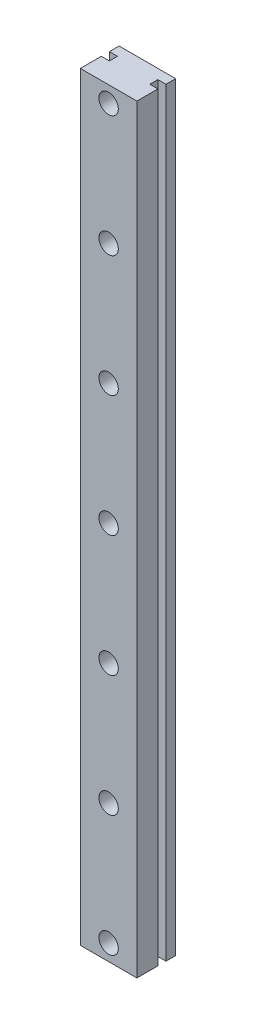
ISO-10303-21;
HEADER;
FILE_DESCRIPTION(('STEP AP214'),'2;1');
FILE_NAME('part.step','',(''),(''),'','','');
FILE_SCHEMA(('AUTOMOTIVE_DESIGN { 1 0 10303 214 1 1 1 1 }'));
ENDSEC;
DATA;
#1=APPLICATION_CONTEXT('core data for automotive mechanical design processes');
#2=APPLICATION_PROTOCOL_DEFINITION('international standard','automotive_design',2000,#1);
#3=PRODUCT_CONTEXT('',#1,'mechanical');
#4=PRODUCT('Part','Part','',(#3));
#5=PRODUCT_RELATED_PRODUCT_CATEGORY('part','',(#4));
#6=PRODUCT_DEFINITION_FORMATION('','',#4);
#7=PRODUCT_DEFINITION_CONTEXT('part definition',#1,'design');
#8=PRODUCT_DEFINITION('design','',#6,#7);
#9=PRODUCT_DEFINITION_SHAPE('','',#8);
#10=(LENGTH_UNIT() NAMED_UNIT(*) SI_UNIT(.MILLI.,.METRE.));
#11=(NAMED_UNIT(*) PLANE_ANGLE_UNIT() SI_UNIT($,.RADIAN.));
#12=(NAMED_UNIT(*) SI_UNIT($,.STERADIAN.) SOLID_ANGLE_UNIT());
#13=UNCERTAINTY_MEASURE_WITH_UNIT(LENGTH_MEASURE(1.E-05),#10,'distance_accuracy_value','');
#14=(GEOMETRIC_REPRESENTATION_CONTEXT(3) GLOBAL_UNCERTAINTY_ASSIGNED_CONTEXT((#13)) GLOBAL_UNIT_ASSIGNED_CONTEXT((#10,
#11,#12)) REPRESENTATION_CONTEXT('',''));
#15=CARTESIAN_POINT('',(0.,0.,0.));
#16=DIRECTION('',(0.,0.,1.));
#17=DIRECTION('',(1.,0.,0.));
#18=AXIS2_PLACEMENT_3D('',#15,#16,#17);
#19=CARTESIAN_POINT('',(0.,94.,0.));
#20=DIRECTION('',(0.,0.,-1.));
#21=DIRECTION('',(-1.,0.,0.));
#22=AXIS2_PLACEMENT_3D('',#19,#20,#21);
#23=PLANE('',#22);
#24=CARTESIAN_POINT('',(3.5,2.,0.));
#25=DIRECTION('',(0.,0.,-1.));
#26=DIRECTION('',(-1.,0.,0.));
#27=AXIS2_PLACEMENT_3D('',#24,#25,#26);
#28=CIRCLE('',#27,1.2);
#29=CARTESIAN_POINT('',(2.3,2.,0.));
#30=VERTEX_POINT('',#29);
#31=EDGE_CURVE('E264',#30,#30,#28,.T.);
#32=ORIENTED_EDGE('',*,*,#31,.T.);
#33=EDGE_LOOP('',(#32));
#34=FACE_BOUND('',#33,.T.);
#35=CARTESIAN_POINT('',(3.49999999999959,17.,0.));
#36=DIRECTION('',(0.,0.,-1.));
#37=DIRECTION('',(-1.,0.,0.));
#38=AXIS2_PLACEMENT_3D('',#35,#36,#37);
#39=CIRCLE('',#38,1.2);
#40=CARTESIAN_POINT('',(2.29999999999959,17.,0.));
#41=VERTEX_POINT('',#40);
#42=EDGE_CURVE('E268',#41,#41,#39,.T.);
#43=ORIENTED_EDGE('',*,*,#42,.T.);
#44=EDGE_LOOP('',(#43));
#45=FACE_BOUND('',#44,.T.);
#46=CARTESIAN_POINT('',(3.49999999999995,62.,0.));
#47=DIRECTION('',(0.,0.,-1.));
#48=DIRECTION('',(-1.,0.,0.));
#49=AXIS2_PLACEMENT_3D('',#46,#47,#48);
#50=CIRCLE('',#49,1.2);
#51=CARTESIAN_POINT('',(2.29999999999995,62.,0.));
#52=VERTEX_POINT('',#51);
#53=EDGE_CURVE('E272',#52,#52,#50,.T.);
#54=ORIENTED_EDGE('',*,*,#53,.T.);
#55=EDGE_LOOP('',(#54));
#56=FACE_BOUND('',#55,.T.);
#57=CARTESIAN_POINT('',(3.5,77.,0.));
#58=DIRECTION('',(0.,0.,-1.));
#59=DIRECTION('',(-1.,0.,0.));
#60=AXIS2_PLACEMENT_3D('',#57,#58,#59);
#61=CIRCLE('',#60,1.20000000000001);
#62=CARTESIAN_POINT('',(2.29999999999999,77.,0.));
#63=VERTEX_POINT('',#62);
#64=EDGE_CURVE('E276',#63,#63,#61,.T.);
#65=ORIENTED_EDGE('',*,*,#64,.T.);
#66=EDGE_LOOP('',(#65));
#67=FACE_BOUND('',#66,.T.);
#68=CARTESIAN_POINT('',(3.5,92.,0.));
#69=DIRECTION('',(0.,0.,-1.));
#70=DIRECTION('',(-1.,0.,0.));
#71=AXIS2_PLACEMENT_3D('',#68,#69,#70);
#72=CIRCLE('',#71,1.20000000000001);
#73=CARTESIAN_POINT('',(2.29999999999999,92.,0.));
#74=VERTEX_POINT('',#73);
#75=EDGE_CURVE('E280',#74,#74,#72,.T.);
#76=ORIENTED_EDGE('',*,*,#75,.T.);
#77=EDGE_LOOP('',(#76));
#78=FACE_BOUND('',#77,.T.);
#79=CARTESIAN_POINT('',(3.49999999999974,32.,0.));
#80=DIRECTION('',(0.,0.,-1.));
#81=DIRECTION('',(-1.,0.,0.));
#82=AXIS2_PLACEMENT_3D('',#79,#80,#81);
#83=CIRCLE('',#82,1.2);
#84=CARTESIAN_POINT('',(2.29999999999974,32.,0.));
#85=VERTEX_POINT('',#84);
#86=EDGE_CURVE('E284',#85,#85,#83,.T.);
#87=ORIENTED_EDGE('',*,*,#86,.T.);
#88=EDGE_LOOP('',(#87));
#89=FACE_BOUND('',#88,.T.);
#90=CARTESIAN_POINT('',(3.4999999999999,47.,0.));
#91=DIRECTION('',(0.,0.,-1.));
#92=DIRECTION('',(-1.,0.,0.));
#93=AXIS2_PLACEMENT_3D('',#90,#91,#92);
#94=CIRCLE('',#93,1.2);
#95=CARTESIAN_POINT('',(2.2999999999999,47.,0.));
#96=VERTEX_POINT('',#95);
#97=EDGE_CURVE('E159',#96,#96,#94,.T.);
#98=ORIENTED_EDGE('',*,*,#97,.T.);
#99=EDGE_LOOP('',(#98));
#100=FACE_BOUND('',#99,.T.);
#101=DIRECTION('',(1.,0.,0.));
#102=VECTOR('',#101,1.);
#103=CARTESIAN_POINT('',(0.,0.,0.));
#104=LINE('',#103,#102);
#105=CARTESIAN_POINT('',(0.,0.,0.));
#106=VERTEX_POINT('',#105);
#107=CARTESIAN_POINT('',(7.,0.,0.));
#108=VERTEX_POINT('',#107);
#109=EDGE_CURVE('E155',#106,#108,#104,.T.);
#110=ORIENTED_EDGE('',*,*,#109,.T.);
#111=DIRECTION('',(0.,-1.,0.));
#112=VECTOR('',#111,1.);
#113=CARTESIAN_POINT('',(7.,94.,0.));
#114=LINE('',#113,#112);
#115=CARTESIAN_POINT('',(7.,94.,0.));
#116=VERTEX_POINT('',#115);
#117=EDGE_CURVE('E11',#116,#108,#114,.T.);
#118=ORIENTED_EDGE('',*,*,#117,.F.);
#119=DIRECTION('',(1.,0.,0.));
#120=VECTOR('',#119,1.);
#121=CARTESIAN_POINT('',(0.,94.,0.));
#122=LINE('',#121,#120);
#123=CARTESIAN_POINT('',(0.,94.,0.));
#124=VERTEX_POINT('',#123);
#125=EDGE_CURVE('E178',#124,#116,#122,.T.);
#126=ORIENTED_EDGE('',*,*,#125,.F.);
#127=DIRECTION('',(0.,-1.,0.));
#128=VECTOR('',#127,1.);
#129=CARTESIAN_POINT('',(0.,94.,0.));
#130=LINE('',#129,#128);
#131=EDGE_CURVE('E151',#124,#106,#130,.T.);
#132=ORIENTED_EDGE('',*,*,#131,.T.);
#133=EDGE_LOOP('',(#110,#118,#126,#132));
#134=FACE_BOUND('',#133,.T.);
#135=ADVANCED_FACE('F35',(#34,#45,#56,#67,#78,#89,#100,#134),#23,.F.);
#136=CARTESIAN_POINT('',(7.,94.,0.));
#137=DIRECTION('',(-1.,0.,0.));
#138=DIRECTION('',(0.,0.,1.));
#139=AXIS2_PLACEMENT_3D('',#136,#137,#138);
#140=PLANE('',#139);
#141=DIRECTION('',(0.,0.,-1.));
#142=VECTOR('',#141,1.);
#143=CARTESIAN_POINT('',(7.,0.,0.));
#144=LINE('',#143,#142);
#145=CARTESIAN_POINT('',(7.,0.,-2.6));
#146=VERTEX_POINT('',#145);
#147=EDGE_CURVE('E158',#108,#146,#144,.T.);
#148=ORIENTED_EDGE('',*,*,#147,.T.);
#149=DIRECTION('',(0.,-1.,0.));
#150=VECTOR('',#149,1.);
#151=CARTESIAN_POINT('',(7.,94.,-2.6));
#152=LINE('',#151,#150);
#153=CARTESIAN_POINT('',(7.,94.,-2.6));
#154=VERTEX_POINT('',#153);
#155=EDGE_CURVE('E43',#154,#146,#152,.T.);
#156=ORIENTED_EDGE('',*,*,#155,.F.);
#157=DIRECTION('',(0.,0.,-1.));
#158=VECTOR('',#157,1.);
#159=CARTESIAN_POINT('',(7.,94.,0.));
#160=LINE('',#159,#158);
#161=EDGE_CURVE('E106',#116,#154,#160,.T.);
#162=ORIENTED_EDGE('',*,*,#161,.F.);
#163=ORIENTED_EDGE('',*,*,#117,.T.);
#164=EDGE_LOOP('',(#148,#156,#162,#163));
#165=FACE_BOUND('',#164,.T.);
#166=ADVANCED_FACE('F256',(#165),#140,.F.);
#167=CARTESIAN_POINT('',(7.,94.,-2.6));
#168=DIRECTION('',(0.,0.,1.));
#169=DIRECTION('',(1.,0.,0.));
#170=AXIS2_PLACEMENT_3D('',#167,#168,#169);
#171=PLANE('',#170);
#172=DIRECTION('',(-1.,0.,0.));
#173=VECTOR('',#172,1.);
#174=CARTESIAN_POINT('',(7.,0.,-2.6));
#175=LINE('',#174,#173);
#176=CARTESIAN_POINT('',(6.,0.,-2.6));
#177=VERTEX_POINT('',#176);
#178=EDGE_CURVE('E161',#146,#177,#175,.T.);
#179=ORIENTED_EDGE('',*,*,#178,.T.);
#180=DIRECTION('',(0.,-1.,0.));
#181=VECTOR('',#180,1.);
#182=CARTESIAN_POINT('',(6.,94.,-2.6));
#183=LINE('',#182,#181);
#184=CARTESIAN_POINT('',(6.,94.,-2.6));
#185=VERTEX_POINT('',#184);
#186=EDGE_CURVE('E197',#185,#177,#183,.T.);
#187=ORIENTED_EDGE('',*,*,#186,.F.);
#188=DIRECTION('',(-1.,0.,0.));
#189=VECTOR('',#188,1.);
#190=CARTESIAN_POINT('',(7.,94.,-2.6));
#191=LINE('',#190,#189);
#192=EDGE_CURVE('E205',#154,#185,#191,.T.);
#193=ORIENTED_EDGE('',*,*,#192,.F.);
#194=ORIENTED_EDGE('',*,*,#155,.T.);
#195=EDGE_LOOP('',(#179,#187,#193,#194));
#196=FACE_BOUND('',#195,.T.);
#197=ADVANCED_FACE('F203',(#196),#171,.F.);
#198=CARTESIAN_POINT('',(6.,94.,-2.6));
#199=DIRECTION('',(-1.,0.,0.));
#200=DIRECTION('',(0.,0.,1.));
#201=AXIS2_PLACEMENT_3D('',#198,#199,#200);
#202=PLANE('',#201);
#203=DIRECTION('',(0.,0.,-1.));
#204=VECTOR('',#203,1.);
#205=CARTESIAN_POINT('',(6.,0.,-2.6));
#206=LINE('',#205,#204);
#207=CARTESIAN_POINT('',(6.,0.,-3.6));
#208=VERTEX_POINT('',#207);
#209=EDGE_CURVE('E163',#177,#208,#206,.T.);
#210=ORIENTED_EDGE('',*,*,#209,.T.);
#211=DIRECTION('',(0.,-1.,0.));
#212=VECTOR('',#211,1.);
#213=CARTESIAN_POINT('',(6.,94.,-3.6));
#214=LINE('',#213,#212);
#215=CARTESIAN_POINT('',(6.,94.,-3.6));
#216=VERTEX_POINT('',#215);
#217=EDGE_CURVE('E194',#216,#208,#214,.T.);
#218=ORIENTED_EDGE('',*,*,#217,.F.);
#219=DIRECTION('',(0.,0.,-1.));
#220=VECTOR('',#219,1.);
#221=CARTESIAN_POINT('',(6.,94.,-2.6));
#222=LINE('',#221,#220);
#223=EDGE_CURVE('E223',#185,#216,#222,.T.);
#224=ORIENTED_EDGE('',*,*,#223,.F.);
#225=ORIENTED_EDGE('',*,*,#186,.T.);
#226=EDGE_LOOP('',(#210,#218,#224,#225));
#227=FACE_BOUND('',#226,.T.);
#228=ADVANCED_FACE('F214',(#227),#202,.F.);
#229=CARTESIAN_POINT('',(6.,94.,-3.6));
#230=DIRECTION('',(0.,0.,-1.));
#231=DIRECTION('',(-1.,0.,0.));
#232=AXIS2_PLACEMENT_3D('',#229,#230,#231);
#233=PLANE('',#232);
#234=DIRECTION('',(1.,0.,0.));
#235=VECTOR('',#234,1.);
#236=CARTESIAN_POINT('',(6.,0.,-3.6));
#237=LINE('',#236,#235);
#238=CARTESIAN_POINT('',(7.,0.,-3.6));
#239=VERTEX_POINT('',#238);
#240=EDGE_CURVE('E165',#208,#239,#237,.T.);
#241=ORIENTED_EDGE('',*,*,#240,.T.);
#242=DIRECTION('',(0.,-1.,0.));
#243=VECTOR('',#242,1.);
#244=CARTESIAN_POINT('',(7.,94.,-3.6));
#245=LINE('',#244,#243);
#246=CARTESIAN_POINT('',(7.,94.,-3.6));
#247=VERTEX_POINT('',#246);
#248=EDGE_CURVE('E191',#247,#239,#245,.T.);
#249=ORIENTED_EDGE('',*,*,#248,.F.);
#250=DIRECTION('',(1.,0.,0.));
#251=VECTOR('',#250,1.);
#252=CARTESIAN_POINT('',(6.,94.,-3.6));
#253=LINE('',#252,#251);
#254=EDGE_CURVE('E220',#216,#247,#253,.T.);
#255=ORIENTED_EDGE('',*,*,#254,.F.);
#256=ORIENTED_EDGE('',*,*,#217,.T.);
#257=EDGE_LOOP('',(#241,#249,#255,#256));
#258=FACE_BOUND('',#257,.T.);
#259=ADVANCED_FACE('F218',(#258),#233,.F.);
#260=CARTESIAN_POINT('',(7.,94.,-3.6));
#261=DIRECTION('',(-1.,0.,0.));
#262=DIRECTION('',(0.,0.,1.));
#263=AXIS2_PLACEMENT_3D('',#260,#261,#262);
#264=PLANE('',#263);
#265=DIRECTION('',(0.,0.,-1.));
#266=VECTOR('',#265,1.);
#267=CARTESIAN_POINT('',(7.,0.,-3.6));
#268=LINE('',#267,#266);
#269=CARTESIAN_POINT('',(7.,0.,-4.8));
#270=VERTEX_POINT('',#269);
#271=EDGE_CURVE('E167',#239,#270,#268,.T.);
#272=ORIENTED_EDGE('',*,*,#271,.T.);
#273=DIRECTION('',(0.,-1.,0.));
#274=VECTOR('',#273,1.);
#275=CARTESIAN_POINT('',(7.,94.,-4.8));
#276=LINE('',#275,#274);
#277=CARTESIAN_POINT('',(7.,94.,-4.8));
#278=VERTEX_POINT('',#277);
#279=EDGE_CURVE('E188',#278,#270,#276,.T.);
#280=ORIENTED_EDGE('',*,*,#279,.F.);
#281=DIRECTION('',(0.,0.,-1.));
#282=VECTOR('',#281,1.);
#283=CARTESIAN_POINT('',(7.,94.,-3.6));
#284=LINE('',#283,#282);
#285=EDGE_CURVE('E222',#247,#278,#284,.T.);
#286=ORIENTED_EDGE('',*,*,#285,.F.);
#287=ORIENTED_EDGE('',*,*,#248,.T.);
#288=EDGE_LOOP('',(#272,#280,#286,#287));
#289=FACE_BOUND('',#288,.T.);
#290=ADVANCED_FACE('F325',(#289),#264,.F.);
#291=CARTESIAN_POINT('',(0.,94.,-4.8));
#292=DIRECTION('',(0.,0.,1.));
#293=DIRECTION('',(1.,0.,0.));
#294=AXIS2_PLACEMENT_3D('',#291,#292,#293);
#295=PLANE('',#294);
#296=CARTESIAN_POINT('',(3.5,2.,-4.8));
#297=DIRECTION('',(0.,0.,-1.));
#298=DIRECTION('',(-1.,0.,0.));
#299=AXIS2_PLACEMENT_3D('',#296,#297,#298);
#300=CIRCLE('',#299,1.2);
#301=CARTESIAN_POINT('',(2.3,2.,-4.8));
#302=VERTEX_POINT('',#301);
#303=EDGE_CURVE('E293',#302,#302,#300,.T.);
#304=ORIENTED_EDGE('',*,*,#303,.F.);
#305=EDGE_LOOP('',(#304));
#306=FACE_BOUND('',#305,.T.);
#307=CARTESIAN_POINT('',(3.49999999999959,17.,-4.8));
#308=DIRECTION('',(0.,0.,-1.));
#309=DIRECTION('',(-1.,0.,0.));
#310=AXIS2_PLACEMENT_3D('',#307,#308,#309);
#311=CIRCLE('',#310,1.2);
#312=CARTESIAN_POINT('',(2.29999999999959,17.,-4.8));
#313=VERTEX_POINT('',#312);
#314=EDGE_CURVE('E299',#313,#313,#311,.T.);
#315=ORIENTED_EDGE('',*,*,#314,.F.);
#316=EDGE_LOOP('',(#315));
#317=FACE_BOUND('',#316,.T.);
#318=CARTESIAN_POINT('',(3.49999999999995,62.,-4.8));
#319=DIRECTION('',(0.,0.,-1.));
#320=DIRECTION('',(-1.,0.,0.));
#321=AXIS2_PLACEMENT_3D('',#318,#319,#320);
#322=CIRCLE('',#321,1.2);
#323=CARTESIAN_POINT('',(2.29999999999995,62.,-4.8));
#324=VERTEX_POINT('',#323);
#325=EDGE_CURVE('E308',#324,#324,#322,.T.);
#326=ORIENTED_EDGE('',*,*,#325,.F.);
#327=EDGE_LOOP('',(#326));
#328=FACE_BOUND('',#327,.T.);
#329=CARTESIAN_POINT('',(3.5,77.,-4.8));
#330=DIRECTION('',(0.,0.,-1.));
#331=DIRECTION('',(-1.,0.,0.));
#332=AXIS2_PLACEMENT_3D('',#329,#330,#331);
#333=CIRCLE('',#332,1.20000000000001);
#334=CARTESIAN_POINT('',(2.29999999999999,77.,-4.8));
#335=VERTEX_POINT('',#334);
#336=EDGE_CURVE('E304',#335,#335,#333,.T.);
#337=ORIENTED_EDGE('',*,*,#336,.F.);
#338=EDGE_LOOP('',(#337));
#339=FACE_BOUND('',#338,.T.);
#340=CARTESIAN_POINT('',(3.5,92.,-4.8));
#341=DIRECTION('',(0.,0.,-1.));
#342=DIRECTION('',(-1.,0.,0.));
#343=AXIS2_PLACEMENT_3D('',#340,#341,#342);
#344=CIRCLE('',#343,1.20000000000001);
#345=CARTESIAN_POINT('',(2.29999999999999,92.,-4.8));
#346=VERTEX_POINT('',#345);
#347=EDGE_CURVE('E315',#346,#346,#344,.T.);
#348=ORIENTED_EDGE('',*,*,#347,.F.);
#349=EDGE_LOOP('',(#348));
#350=FACE_BOUND('',#349,.T.);
#351=CARTESIAN_POINT('',(3.49999999999974,32.,-4.8));
#352=DIRECTION('',(0.,0.,-1.));
#353=DIRECTION('',(-1.,0.,0.));
#354=AXIS2_PLACEMENT_3D('',#351,#352,#353);
#355=CIRCLE('',#354,1.2);
#356=CARTESIAN_POINT('',(2.29999999999974,32.,-4.8));
#357=VERTEX_POINT('',#356);
#358=EDGE_CURVE('E303',#357,#357,#355,.T.);
#359=ORIENTED_EDGE('',*,*,#358,.F.);
#360=EDGE_LOOP('',(#359));
#361=FACE_BOUND('',#360,.T.);
#362=CARTESIAN_POINT('',(3.4999999999999,47.,-4.8));
#363=DIRECTION('',(0.,0.,-1.));
#364=DIRECTION('',(-1.,0.,0.));
#365=AXIS2_PLACEMENT_3D('',#362,#363,#364);
#366=CIRCLE('',#365,1.2);
#367=CARTESIAN_POINT('',(2.2999999999999,47.,-4.8));
#368=VERTEX_POINT('',#367);
#369=EDGE_CURVE('E288',#368,#368,#366,.T.);
#370=ORIENTED_EDGE('',*,*,#369,.F.);
#371=EDGE_LOOP('',(#370));
#372=FACE_BOUND('',#371,.T.);
#373=DIRECTION('',(-1.,0.,0.));
#374=VECTOR('',#373,1.);
#375=CARTESIAN_POINT('',(0.,0.,-4.8));
#376=LINE('',#375,#374);
#377=CARTESIAN_POINT('',(0.,0.,-4.8));
#378=VERTEX_POINT('',#377);
#379=EDGE_CURVE('E169',#270,#378,#376,.T.);
#380=ORIENTED_EDGE('',*,*,#379,.T.);
#381=DIRECTION('',(0.,-1.,0.));
#382=VECTOR('',#381,1.);
#383=CARTESIAN_POINT('',(0.,94.,-4.8));
#384=LINE('',#383,#382);
#385=CARTESIAN_POINT('',(0.,94.,-4.8));
#386=VERTEX_POINT('',#385);
#387=EDGE_CURVE('E185',#386,#378,#384,.T.);
#388=ORIENTED_EDGE('',*,*,#387,.F.);
#389=DIRECTION('',(-1.,0.,0.));
#390=VECTOR('',#389,1.);
#391=CARTESIAN_POINT('',(0.,94.,-4.8));
#392=LINE('',#391,#390);
#393=EDGE_CURVE('E225',#278,#386,#392,.T.);
#394=ORIENTED_EDGE('',*,*,#393,.F.);
#395=ORIENTED_EDGE('',*,*,#279,.T.);
#396=EDGE_LOOP('',(#380,#388,#394,#395));
#397=FACE_BOUND('',#396,.T.);
#398=ADVANCED_FACE('F322',(#306,#317,#328,#339,#350,#361,#372,#397),#295,.F.);
#399=CARTESIAN_POINT('',(0.,94.,-3.6));
#400=DIRECTION('',(1.,0.,0.));
#401=DIRECTION('',(0.,0.,-1.));
#402=AXIS2_PLACEMENT_3D('',#399,#400,#401);
#403=PLANE('',#402);
#404=DIRECTION('',(0.,0.,1.));
#405=VECTOR('',#404,1.);
#406=CARTESIAN_POINT('',(0.,0.,-3.6));
#407=LINE('',#406,#405);
#408=CARTESIAN_POINT('',(0.,0.,-3.6));
#409=VERTEX_POINT('',#408);
#410=EDGE_CURVE('E171',#378,#409,#407,.T.);
#411=ORIENTED_EDGE('',*,*,#410,.T.);
#412=DIRECTION('',(0.,-1.,0.));
#413=VECTOR('',#412,1.);
#414=CARTESIAN_POINT('',(0.,94.,-3.6));
#415=LINE('',#414,#413);
#416=CARTESIAN_POINT('',(0.,94.,-3.6));
#417=VERTEX_POINT('',#416);
#418=EDGE_CURVE('E182',#417,#409,#415,.T.);
#419=ORIENTED_EDGE('',*,*,#418,.F.);
#420=DIRECTION('',(0.,0.,1.));
#421=VECTOR('',#420,1.);
#422=CARTESIAN_POINT('',(0.,94.,-3.6));
#423=LINE('',#422,#421);
#424=EDGE_CURVE('E231',#386,#417,#423,.T.);
#425=ORIENTED_EDGE('',*,*,#424,.F.);
#426=ORIENTED_EDGE('',*,*,#387,.T.);
#427=EDGE_LOOP('',(#411,#419,#425,#426));
#428=FACE_BOUND('',#427,.T.);
#429=ADVANCED_FACE('F237',(#428),#403,.F.);
#430=CARTESIAN_POINT('',(1.,94.,-3.6));
#431=DIRECTION('',(0.,0.,-1.));
#432=DIRECTION('',(-1.,0.,0.));
#433=AXIS2_PLACEMENT_3D('',#430,#431,#432);
#434=PLANE('',#433);
#435=DIRECTION('',(1.,0.,0.));
#436=VECTOR('',#435,1.);
#437=CARTESIAN_POINT('',(1.,0.,-3.6));
#438=LINE('',#437,#436);
#439=CARTESIAN_POINT('',(1.,0.,-3.6));
#440=VERTEX_POINT('',#439);
#441=EDGE_CURVE('E173',#409,#440,#438,.T.);
#442=ORIENTED_EDGE('',*,*,#441,.T.);
#443=DIRECTION('',(0.,-1.,0.));
#444=VECTOR('',#443,1.);
#445=CARTESIAN_POINT('',(1.,94.,-3.6));
#446=LINE('',#445,#444);
#447=CARTESIAN_POINT('',(1.,94.,-3.6));
#448=VERTEX_POINT('',#447);
#449=EDGE_CURVE('E146',#448,#440,#446,.T.);
#450=ORIENTED_EDGE('',*,*,#449,.F.);
#451=DIRECTION('',(1.,0.,0.));
#452=VECTOR('',#451,1.);
#453=CARTESIAN_POINT('',(1.,94.,-3.6));
#454=LINE('',#453,#452);
#455=EDGE_CURVE('E137',#417,#448,#454,.T.);
#456=ORIENTED_EDGE('',*,*,#455,.F.);
#457=ORIENTED_EDGE('',*,*,#418,.T.);
#458=EDGE_LOOP('',(#442,#450,#456,#457));
#459=FACE_BOUND('',#458,.T.);
#460=ADVANCED_FACE('F241',(#459),#434,.F.);
#461=CARTESIAN_POINT('',(1.,94.,-2.6));
#462=DIRECTION('',(1.,0.,0.));
#463=DIRECTION('',(0.,0.,-1.));
#464=AXIS2_PLACEMENT_3D('',#461,#462,#463);
#465=PLANE('',#464);
#466=DIRECTION('',(0.,0.,1.));
#467=VECTOR('',#466,1.);
#468=CARTESIAN_POINT('',(1.,0.,-2.6));
#469=LINE('',#468,#467);
#470=CARTESIAN_POINT('',(1.,0.,-2.6));
#471=VERTEX_POINT('',#470);
#472=EDGE_CURVE('E145',#440,#471,#469,.T.);
#473=ORIENTED_EDGE('',*,*,#472,.T.);
#474=DIRECTION('',(0.,-1.,0.));
#475=VECTOR('',#474,1.);
#476=CARTESIAN_POINT('',(1.,94.,-2.6));
#477=LINE('',#476,#475);
#478=CARTESIAN_POINT('',(1.,94.,-2.6));
#479=VERTEX_POINT('',#478);
#480=EDGE_CURVE('E142',#479,#471,#477,.T.);
#481=ORIENTED_EDGE('',*,*,#480,.F.);
#482=DIRECTION('',(0.,0.,1.));
#483=VECTOR('',#482,1.);
#484=CARTESIAN_POINT('',(1.,94.,-2.6));
#485=LINE('',#484,#483);
#486=EDGE_CURVE('E131',#448,#479,#485,.T.);
#487=ORIENTED_EDGE('',*,*,#486,.F.);
#488=ORIENTED_EDGE('',*,*,#449,.T.);
#489=EDGE_LOOP('',(#473,#481,#487,#488));
#490=FACE_BOUND('',#489,.T.);
#491=ADVANCED_FACE('F143',(#490),#465,.F.);
#492=CARTESIAN_POINT('',(0.,94.,-2.6));
#493=DIRECTION('',(0.,0.,1.));
#494=DIRECTION('',(1.,0.,0.));
#495=AXIS2_PLACEMENT_3D('',#492,#493,#494);
#496=PLANE('',#495);
#497=DIRECTION('',(-1.,0.,0.));
#498=VECTOR('',#497,1.);
#499=CARTESIAN_POINT('',(0.,0.,-2.6));
#500=LINE('',#499,#498);
#501=CARTESIAN_POINT('',(0.,0.,-2.6));
#502=VERTEX_POINT('',#501);
#503=EDGE_CURVE('E92',#471,#502,#500,.T.);
#504=ORIENTED_EDGE('',*,*,#503,.T.);
#505=DIRECTION('',(0.,-1.,0.));
#506=VECTOR('',#505,1.);
#507=CARTESIAN_POINT('',(0.,94.,-2.6));
#508=LINE('',#507,#506);
#509=CARTESIAN_POINT('',(0.,94.,-2.6));
#510=VERTEX_POINT('',#509);
#511=EDGE_CURVE('E147',#510,#502,#508,.T.);
#512=ORIENTED_EDGE('',*,*,#511,.F.);
#513=DIRECTION('',(-1.,0.,0.));
#514=VECTOR('',#513,1.);
#515=CARTESIAN_POINT('',(0.,94.,-2.6));
#516=LINE('',#515,#514);
#517=EDGE_CURVE('E135',#479,#510,#516,.T.);
#518=ORIENTED_EDGE('',*,*,#517,.F.);
#519=ORIENTED_EDGE('',*,*,#480,.T.);
#520=EDGE_LOOP('',(#504,#512,#518,#519));
#521=FACE_BOUND('',#520,.T.);
#522=ADVANCED_FACE('F149',(#521),#496,.F.);
#523=CARTESIAN_POINT('',(0.,94.,0.));
#524=DIRECTION('',(1.,0.,0.));
#525=DIRECTION('',(0.,0.,-1.));
#526=AXIS2_PLACEMENT_3D('',#523,#524,#525);
#527=PLANE('',#526);
#528=DIRECTION('',(0.,0.,1.));
#529=VECTOR('',#528,1.);
#530=CARTESIAN_POINT('',(0.,0.,0.));
#531=LINE('',#530,#529);
#532=EDGE_CURVE('E98',#502,#106,#531,.T.);
#533=ORIENTED_EDGE('',*,*,#532,.T.);
#534=ORIENTED_EDGE('',*,*,#131,.F.);
#535=DIRECTION('',(0.,0.,1.));
#536=VECTOR('',#535,1.);
#537=CARTESIAN_POINT('',(0.,94.,0.));
#538=LINE('',#537,#536);
#539=EDGE_CURVE('E51',#510,#124,#538,.T.);
#540=ORIENTED_EDGE('',*,*,#539,.F.);
#541=ORIENTED_EDGE('',*,*,#511,.T.);
#542=EDGE_LOOP('',(#533,#534,#540,#541));
#543=FACE_BOUND('',#542,.T.);
#544=ADVANCED_FACE('F245',(#543),#527,.F.);
#545=CARTESIAN_POINT('',(0.,94.,0.));
#546=DIRECTION('',(0.,1.,0.));
#547=DIRECTION('',(0.,0.,1.));
#548=AXIS2_PLACEMENT_3D('',#545,#546,#547);
#549=PLANE('',#548);
#550=ORIENTED_EDGE('',*,*,#125,.T.);
#551=ORIENTED_EDGE('',*,*,#161,.T.);
#552=ORIENTED_EDGE('',*,*,#192,.T.);
#553=ORIENTED_EDGE('',*,*,#223,.T.);
#554=ORIENTED_EDGE('',*,*,#254,.T.);
#555=ORIENTED_EDGE('',*,*,#285,.T.);
#556=ORIENTED_EDGE('',*,*,#393,.T.);
#557=ORIENTED_EDGE('',*,*,#424,.T.);
#558=ORIENTED_EDGE('',*,*,#455,.T.);
#559=ORIENTED_EDGE('',*,*,#486,.T.);
#560=ORIENTED_EDGE('',*,*,#517,.T.);
#561=ORIENTED_EDGE('',*,*,#539,.T.);
#562=EDGE_LOOP('',(#550,#551,#552,#553,#554,#555,#556,#557,#558,#559,#560,#561));
#563=FACE_BOUND('',#562,.T.);
#564=ADVANCED_FACE('F133',(#563),#549,.T.);
#565=CARTESIAN_POINT('',(0.,0.,0.));
#566=DIRECTION('',(0.,1.,0.));
#567=DIRECTION('',(0.,0.,1.));
#568=AXIS2_PLACEMENT_3D('',#565,#566,#567);
#569=PLANE('',#568);
#570=ORIENTED_EDGE('',*,*,#109,.F.);
#571=ORIENTED_EDGE('',*,*,#532,.F.);
#572=ORIENTED_EDGE('',*,*,#503,.F.);
#573=ORIENTED_EDGE('',*,*,#472,.F.);
#574=ORIENTED_EDGE('',*,*,#441,.F.);
#575=ORIENTED_EDGE('',*,*,#410,.F.);
#576=ORIENTED_EDGE('',*,*,#379,.F.);
#577=ORIENTED_EDGE('',*,*,#271,.F.);
#578=ORIENTED_EDGE('',*,*,#240,.F.);
#579=ORIENTED_EDGE('',*,*,#209,.F.);
#580=ORIENTED_EDGE('',*,*,#178,.F.);
#581=ORIENTED_EDGE('',*,*,#147,.F.);
#582=EDGE_LOOP('',(#570,#571,#572,#573,#574,#575,#576,#577,#578,#579,#580,#581));
#583=FACE_BOUND('',#582,.T.);
#584=ADVANCED_FACE('F209',(#583),#569,.F.);
#585=CARTESIAN_POINT('',(3.4999999999999,47.,0.));
#586=DIRECTION('',(0.,0.,-1.));
#587=DIRECTION('',(-1.,0.,0.));
#588=AXIS2_PLACEMENT_3D('',#585,#586,#587);
#589=CYLINDRICAL_SURFACE('',#588,1.2);
#590=ORIENTED_EDGE('',*,*,#97,.F.);
#591=EDGE_LOOP('',(#590));
#592=FACE_BOUND('',#591,.T.);
#593=ORIENTED_EDGE('',*,*,#369,.T.);
#594=EDGE_LOOP('',(#593));
#595=FACE_BOUND('',#594,.T.);
#596=ADVANCED_FACE('F410',(#592,#595),#589,.F.);
#597=CARTESIAN_POINT('',(3.49999999999974,32.,0.));
#598=DIRECTION('',(0.,0.,-1.));
#599=DIRECTION('',(-1.,0.,0.));
#600=AXIS2_PLACEMENT_3D('',#597,#598,#599);
#601=CYLINDRICAL_SURFACE('',#600,1.2);
#602=ORIENTED_EDGE('',*,*,#86,.F.);
#603=EDGE_LOOP('',(#602));
#604=FACE_BOUND('',#603,.T.);
#605=ORIENTED_EDGE('',*,*,#358,.T.);
#606=EDGE_LOOP('',(#605));
#607=FACE_BOUND('',#606,.T.);
#608=ADVANCED_FACE('F429',(#604,#607),#601,.F.);
#609=CARTESIAN_POINT('',(3.5,92.,0.));
#610=DIRECTION('',(0.,0.,-1.));
#611=DIRECTION('',(-1.,0.,0.));
#612=AXIS2_PLACEMENT_3D('',#609,#610,#611);
#613=CYLINDRICAL_SURFACE('',#612,1.20000000000001);
#614=ORIENTED_EDGE('',*,*,#75,.F.);
#615=EDGE_LOOP('',(#614));
#616=FACE_BOUND('',#615,.T.);
#617=ORIENTED_EDGE('',*,*,#347,.T.);
#618=EDGE_LOOP('',(#617));
#619=FACE_BOUND('',#618,.T.);
#620=ADVANCED_FACE('F320',(#616,#619),#613,.F.);
#621=CARTESIAN_POINT('',(3.5,77.,0.));
#622=DIRECTION('',(0.,0.,-1.));
#623=DIRECTION('',(-1.,0.,0.));
#624=AXIS2_PLACEMENT_3D('',#621,#622,#623);
#625=CYLINDRICAL_SURFACE('',#624,1.20000000000001);
#626=ORIENTED_EDGE('',*,*,#64,.F.);
#627=EDGE_LOOP('',(#626));
#628=FACE_BOUND('',#627,.T.);
#629=ORIENTED_EDGE('',*,*,#336,.T.);
#630=EDGE_LOOP('',(#629));
#631=FACE_BOUND('',#630,.T.);
#632=ADVANCED_FACE('F447',(#628,#631),#625,.F.);
#633=CARTESIAN_POINT('',(3.49999999999995,62.,0.));
#634=DIRECTION('',(0.,0.,-1.));
#635=DIRECTION('',(-1.,0.,0.));
#636=AXIS2_PLACEMENT_3D('',#633,#634,#635);
#637=CYLINDRICAL_SURFACE('',#636,1.2);
#638=ORIENTED_EDGE('',*,*,#53,.F.);
#639=EDGE_LOOP('',(#638));
#640=FACE_BOUND('',#639,.T.);
#641=ORIENTED_EDGE('',*,*,#325,.T.);
#642=EDGE_LOOP('',(#641));
#643=FACE_BOUND('',#642,.T.);
#644=ADVANCED_FACE('F457',(#640,#643),#637,.F.);
#645=CARTESIAN_POINT('',(3.49999999999959,17.,0.));
#646=DIRECTION('',(0.,0.,-1.));
#647=DIRECTION('',(-1.,0.,0.));
#648=AXIS2_PLACEMENT_3D('',#645,#646,#647);
#649=CYLINDRICAL_SURFACE('',#648,1.2);
#650=ORIENTED_EDGE('',*,*,#42,.F.);
#651=EDGE_LOOP('',(#650));
#652=FACE_BOUND('',#651,.T.);
#653=ORIENTED_EDGE('',*,*,#314,.T.);
#654=EDGE_LOOP('',(#653));
#655=FACE_BOUND('',#654,.T.);
#656=ADVANCED_FACE('F467',(#652,#655),#649,.F.);
#657=CARTESIAN_POINT('',(3.5,2.,0.));
#658=DIRECTION('',(0.,0.,-1.));
#659=DIRECTION('',(-1.,0.,0.));
#660=AXIS2_PLACEMENT_3D('',#657,#658,#659);
#661=CYLINDRICAL_SURFACE('',#660,1.2);
#662=ORIENTED_EDGE('',*,*,#31,.F.);
#663=EDGE_LOOP('',(#662));
#664=FACE_BOUND('',#663,.T.);
#665=ORIENTED_EDGE('',*,*,#303,.T.);
#666=EDGE_LOOP('',(#665));
#667=FACE_BOUND('',#666,.T.);
#668=ADVANCED_FACE('F477',(#664,#667),#661,.F.);
#669=CLOSED_SHELL('',(#135,#166,#197,#228,#259,#290,#398,#429,#460,#491,#522,#544,#564,#584,
#596,#608,#620,#632,#644,#656,#668));
#670=MANIFOLD_SOLID_BREP('B2',#669);
#671=ADVANCED_BREP_SHAPE_REPRESENTATION('',(#18,#670),#14);
#672=SHAPE_DEFINITION_REPRESENTATION(#9,#671);
ENDSEC;
END-ISO-10303-21;
